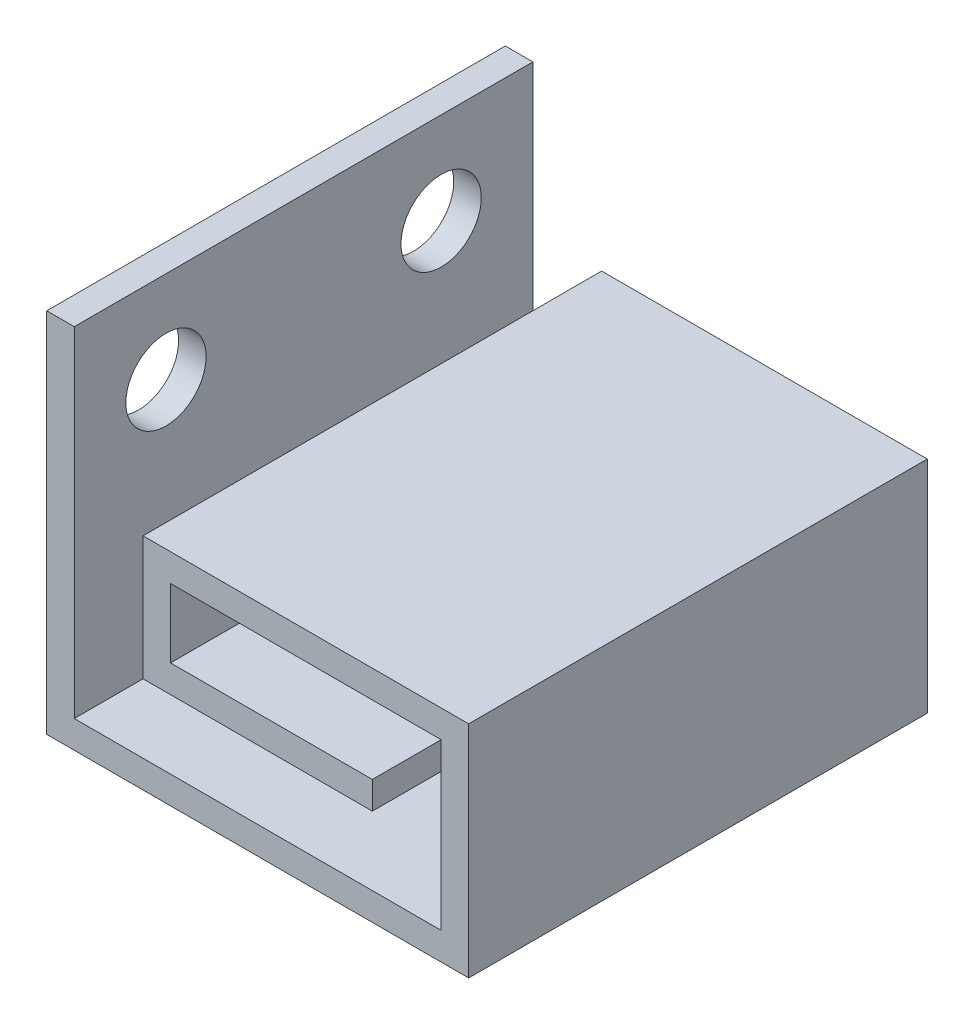
ISO-10303-21;
HEADER;
FILE_DESCRIPTION(('STEP AP214'),'2;1');
FILE_NAME('part.step','',(''),(''),'','','');
FILE_SCHEMA(('AUTOMOTIVE_DESIGN { 1 0 10303 214 1 1 1 1 }'));
ENDSEC;
DATA;
#1=APPLICATION_CONTEXT('core data for automotive mechanical design processes');
#2=APPLICATION_PROTOCOL_DEFINITION('international standard','automotive_design',2000,#1);
#3=PRODUCT_CONTEXT('',#1,'mechanical');
#4=PRODUCT('Part','Part','',(#3));
#5=PRODUCT_RELATED_PRODUCT_CATEGORY('part','',(#4));
#6=PRODUCT_DEFINITION_FORMATION('','',#4);
#7=PRODUCT_DEFINITION_CONTEXT('part definition',#1,'design');
#8=PRODUCT_DEFINITION('design','',#6,#7);
#9=PRODUCT_DEFINITION_SHAPE('','',#8);
#10=(LENGTH_UNIT() NAMED_UNIT(*) SI_UNIT(.MILLI.,.METRE.));
#11=(NAMED_UNIT(*) PLANE_ANGLE_UNIT() SI_UNIT($,.RADIAN.));
#12=(NAMED_UNIT(*) SI_UNIT($,.STERADIAN.) SOLID_ANGLE_UNIT());
#13=UNCERTAINTY_MEASURE_WITH_UNIT(LENGTH_MEASURE(1.E-05),#10,'distance_accuracy_value','');
#14=(GEOMETRIC_REPRESENTATION_CONTEXT(3) GLOBAL_UNCERTAINTY_ASSIGNED_CONTEXT((#13)) GLOBAL_UNIT_ASSIGNED_CONTEXT((#10,
#11,#12)) REPRESENTATION_CONTEXT('',''));
#15=CARTESIAN_POINT('',(0.,0.,0.));
#16=DIRECTION('',(0.,0.,1.));
#17=DIRECTION('',(1.,0.,0.));
#18=AXIS2_PLACEMENT_3D('',#15,#16,#17);
#19=CARTESIAN_POINT('',(0.,0.,10.));
#20=DIRECTION('',(1.,0.,0.));
#21=DIRECTION('',(0.,0.,-1.));
#22=AXIS2_PLACEMENT_3D('',#19,#20,#21);
#23=PLANE('',#22);
#24=CARTESIAN_POINT('',(0.,12.,6.));
#25=DIRECTION('',(1.,0.,0.));
#26=DIRECTION('',(0.,0.,-1.));
#27=AXIS2_PLACEMENT_3D('',#24,#25,#26);
#28=CIRCLE('',#27,1.75);
#29=CARTESIAN_POINT('',(0.,12.,4.25));
#30=VERTEX_POINT('',#29);
#31=EDGE_CURVE('E177',#30,#30,#28,.T.);
#32=ORIENTED_EDGE('',*,*,#31,.T.);
#33=EDGE_LOOP('',(#32));
#34=FACE_BOUND('',#33,.T.);
#35=CARTESIAN_POINT('',(0.,12.,-6.));
#36=DIRECTION('',(1.,0.,0.));
#37=DIRECTION('',(0.,0.,-1.));
#38=AXIS2_PLACEMENT_3D('',#35,#36,#37);
#39=CIRCLE('',#38,1.75);
#40=CARTESIAN_POINT('',(0.,12.,-7.75));
#41=VERTEX_POINT('',#40);
#42=EDGE_CURVE('E231',#41,#41,#39,.T.);
#43=ORIENTED_EDGE('',*,*,#42,.T.);
#44=EDGE_LOOP('',(#43));
#45=FACE_BOUND('',#44,.T.);
#46=DIRECTION('',(0.,-1.,0.));
#47=VECTOR('',#46,1.);
#48=CARTESIAN_POINT('',(0.,0.,-10.));
#49=LINE('',#48,#47);
#50=CARTESIAN_POINT('',(0.,16.,-10.));
#51=VERTEX_POINT('',#50);
#52=CARTESIAN_POINT('',(0.,0.,-10.));
#53=VERTEX_POINT('',#52);
#54=EDGE_CURVE('E173',#51,#53,#49,.T.);
#55=ORIENTED_EDGE('',*,*,#54,.T.);
#56=DIRECTION('',(0.,0.,-1.));
#57=VECTOR('',#56,1.);
#58=CARTESIAN_POINT('',(0.,0.,10.));
#59=LINE('',#58,#57);
#60=CARTESIAN_POINT('',(0.,0.,10.));
#61=VERTEX_POINT('',#60);
#62=EDGE_CURVE('E11',#61,#53,#59,.T.);
#63=ORIENTED_EDGE('',*,*,#62,.F.);
#64=DIRECTION('',(0.,-1.,0.));
#65=VECTOR('',#64,1.);
#66=CARTESIAN_POINT('',(0.,0.,10.));
#67=LINE('',#66,#65);
#68=CARTESIAN_POINT('',(0.,16.,10.));
#69=VERTEX_POINT('',#68);
#70=EDGE_CURVE('E200',#69,#61,#67,.T.);
#71=ORIENTED_EDGE('',*,*,#70,.F.);
#72=DIRECTION('',(0.,0.,-1.));
#73=VECTOR('',#72,1.);
#74=CARTESIAN_POINT('',(0.,16.,10.));
#75=LINE('',#74,#73);
#76=EDGE_CURVE('E169',#69,#51,#75,.T.);
#77=ORIENTED_EDGE('',*,*,#76,.T.);
#78=EDGE_LOOP('',(#55,#63,#71,#77));
#79=FACE_BOUND('',#78,.T.);
#80=ADVANCED_FACE('F39',(#34,#45,#79),#23,.F.);
#81=CARTESIAN_POINT('',(0.,0.,10.));
#82=DIRECTION('',(0.,1.,0.));
#83=DIRECTION('',(0.,0.,1.));
#84=AXIS2_PLACEMENT_3D('',#81,#82,#83);
#85=PLANE('',#84);
#86=DIRECTION('',(1.,0.,0.));
#87=VECTOR('',#86,1.);
#88=CARTESIAN_POINT('',(0.,0.,-10.));
#89=LINE('',#88,#87);
#90=CARTESIAN_POINT('',(18.4,0.,-10.));
#91=VERTEX_POINT('',#90);
#92=EDGE_CURVE('E176',#53,#91,#89,.T.);
#93=ORIENTED_EDGE('',*,*,#92,.T.);
#94=DIRECTION('',(0.,0.,-1.));
#95=VECTOR('',#94,1.);
#96=CARTESIAN_POINT('',(18.4,0.,10.));
#97=LINE('',#96,#95);
#98=CARTESIAN_POINT('',(18.4,0.,10.));
#99=VERTEX_POINT('',#98);
#100=EDGE_CURVE('E48',#99,#91,#97,.T.);
#101=ORIENTED_EDGE('',*,*,#100,.F.);
#102=DIRECTION('',(1.,0.,0.));
#103=VECTOR('',#102,1.);
#104=CARTESIAN_POINT('',(0.,0.,10.));
#105=LINE('',#104,#103);
#106=EDGE_CURVE('E118',#61,#99,#105,.T.);
#107=ORIENTED_EDGE('',*,*,#106,.F.);
#108=ORIENTED_EDGE('',*,*,#62,.T.);
#109=EDGE_LOOP('',(#93,#101,#107,#108));
#110=FACE_BOUND('',#109,.T.);
#111=ADVANCED_FACE('F289',(#110),#85,.F.);
#112=CARTESIAN_POINT('',(18.4,0.,10.));
#113=DIRECTION('',(-1.,0.,0.));
#114=DIRECTION('',(0.,0.,1.));
#115=AXIS2_PLACEMENT_3D('',#112,#113,#114);
#116=PLANE('',#115);
#117=DIRECTION('',(0.,1.,0.));
#118=VECTOR('',#117,1.);
#119=CARTESIAN_POINT('',(18.4,0.,-10.));
#120=LINE('',#119,#118);
#121=CARTESIAN_POINT('',(18.4,9.6,-10.));
#122=VERTEX_POINT('',#121);
#123=EDGE_CURVE('E179',#91,#122,#120,.T.);
#124=ORIENTED_EDGE('',*,*,#123,.T.);
#125=DIRECTION('',(0.,0.,-1.));
#126=VECTOR('',#125,1.);
#127=CARTESIAN_POINT('',(18.4,9.6,10.));
#128=LINE('',#127,#126);
#129=CARTESIAN_POINT('',(18.4,9.6,10.));
#130=VERTEX_POINT('',#129);
#131=EDGE_CURVE('E225',#130,#122,#128,.T.);
#132=ORIENTED_EDGE('',*,*,#131,.F.);
#133=DIRECTION('',(0.,1.,0.));
#134=VECTOR('',#133,1.);
#135=CARTESIAN_POINT('',(18.4,0.,10.));
#136=LINE('',#135,#134);
#137=EDGE_CURVE('E244',#99,#130,#136,.T.);
#138=ORIENTED_EDGE('',*,*,#137,.F.);
#139=ORIENTED_EDGE('',*,*,#100,.T.);
#140=EDGE_LOOP('',(#124,#132,#138,#139));
#141=FACE_BOUND('',#140,.T.);
#142=ADVANCED_FACE('F295',(#141),#116,.F.);
#143=CARTESIAN_POINT('',(18.4,9.6,10.));
#144=DIRECTION('',(0.,-1.,0.));
#145=DIRECTION('',(1.,0.,0.));
#146=AXIS2_PLACEMENT_3D('',#143,#144,#145);
#147=PLANE('',#146);
#148=DIRECTION('',(-1.,0.,0.));
#149=VECTOR('',#148,1.);
#150=CARTESIAN_POINT('',(18.4,9.6,-10.));
#151=LINE('',#150,#149);
#152=CARTESIAN_POINT('',(4.2,9.6,-10.));
#153=VERTEX_POINT('',#152);
#154=EDGE_CURVE('E181',#122,#153,#151,.T.);
#155=ORIENTED_EDGE('',*,*,#154,.T.);
#156=DIRECTION('',(0.,0.,-1.));
#157=VECTOR('',#156,1.);
#158=CARTESIAN_POINT('',(4.2,9.6,10.));
#159=LINE('',#158,#157);
#160=CARTESIAN_POINT('',(4.2,9.6,10.));
#161=VERTEX_POINT('',#160);
#162=EDGE_CURVE('E222',#161,#153,#159,.T.);
#163=ORIENTED_EDGE('',*,*,#162,.F.);
#164=DIRECTION('',(-1.,0.,0.));
#165=VECTOR('',#164,1.);
#166=CARTESIAN_POINT('',(18.4,9.6,10.));
#167=LINE('',#166,#165);
#168=EDGE_CURVE('E246',#130,#161,#167,.T.);
#169=ORIENTED_EDGE('',*,*,#168,.F.);
#170=ORIENTED_EDGE('',*,*,#131,.T.);
#171=EDGE_LOOP('',(#155,#163,#169,#170));
#172=FACE_BOUND('',#171,.T.);
#173=ADVANCED_FACE('F401',(#172),#147,.F.);
#174=CARTESIAN_POINT('',(4.2,9.6,10.));
#175=DIRECTION('',(1.,0.,0.));
#176=DIRECTION('',(0.,1.,0.));
#177=AXIS2_PLACEMENT_3D('',#174,#175,#176);
#178=PLANE('',#177);
#179=DIRECTION('',(0.,-1.,0.));
#180=VECTOR('',#179,1.);
#181=CARTESIAN_POINT('',(4.2,9.6,-10.));
#182=LINE('',#181,#180);
#183=CARTESIAN_POINT('',(4.2,4.2,-10.));
#184=VERTEX_POINT('',#183);
#185=EDGE_CURVE('E183',#153,#184,#182,.T.);
#186=ORIENTED_EDGE('',*,*,#185,.T.);
#187=DIRECTION('',(0.,0.,-1.));
#188=VECTOR('',#187,1.);
#189=CARTESIAN_POINT('',(4.2,4.2,10.));
#190=LINE('',#189,#188);
#191=CARTESIAN_POINT('',(4.2,4.2,10.));
#192=VERTEX_POINT('',#191);
#193=EDGE_CURVE('E219',#192,#184,#190,.T.);
#194=ORIENTED_EDGE('',*,*,#193,.F.);
#195=DIRECTION('',(0.,-1.,0.));
#196=VECTOR('',#195,1.);
#197=CARTESIAN_POINT('',(4.2,9.6,10.));
#198=LINE('',#197,#196);
#199=EDGE_CURVE('E248',#161,#192,#198,.T.);
#200=ORIENTED_EDGE('',*,*,#199,.F.);
#201=ORIENTED_EDGE('',*,*,#162,.T.);
#202=EDGE_LOOP('',(#186,#194,#200,#201));
#203=FACE_BOUND('',#202,.T.);
#204=ADVANCED_FACE('F391',(#203),#178,.F.);
#205=CARTESIAN_POINT('',(4.2,4.2,10.));
#206=DIRECTION('',(0.,1.,0.));
#207=DIRECTION('',(0.,0.,1.));
#208=AXIS2_PLACEMENT_3D('',#205,#206,#207);
#209=PLANE('',#208);
#210=DIRECTION('',(1.,0.,0.));
#211=VECTOR('',#210,1.);
#212=CARTESIAN_POINT('',(4.2,4.2,-10.));
#213=LINE('',#212,#211);
#214=CARTESIAN_POINT('',(14.2,4.2,-10.));
#215=VERTEX_POINT('',#214);
#216=EDGE_CURVE('E185',#184,#215,#213,.T.);
#217=ORIENTED_EDGE('',*,*,#216,.T.);
#218=DIRECTION('',(0.,0.,-1.));
#219=VECTOR('',#218,1.);
#220=CARTESIAN_POINT('',(14.2,4.2,10.));
#221=LINE('',#220,#219);
#222=CARTESIAN_POINT('',(14.2,4.2,10.));
#223=VERTEX_POINT('',#222);
#224=EDGE_CURVE('E216',#223,#215,#221,.T.);
#225=ORIENTED_EDGE('',*,*,#224,.F.);
#226=DIRECTION('',(1.,0.,0.));
#227=VECTOR('',#226,1.);
#228=CARTESIAN_POINT('',(4.2,4.2,10.));
#229=LINE('',#228,#227);
#230=EDGE_CURVE('E250',#192,#223,#229,.T.);
#231=ORIENTED_EDGE('',*,*,#230,.F.);
#232=ORIENTED_EDGE('',*,*,#193,.T.);
#233=EDGE_LOOP('',(#217,#225,#231,#232));
#234=FACE_BOUND('',#233,.T.);
#235=ADVANCED_FACE('F381',(#234),#209,.F.);
#236=CARTESIAN_POINT('',(14.2,5.4,10.));
#237=DIRECTION('',(-1.,0.,0.));
#238=DIRECTION('',(0.,0.,1.));
#239=AXIS2_PLACEMENT_3D('',#236,#237,#238);
#240=PLANE('',#239);
#241=DIRECTION('',(0.,1.,0.));
#242=VECTOR('',#241,1.);
#243=CARTESIAN_POINT('',(14.2,5.4,-10.));
#244=LINE('',#243,#242);
#245=CARTESIAN_POINT('',(14.2,5.4,-10.));
#246=VERTEX_POINT('',#245);
#247=EDGE_CURVE('E187',#215,#246,#244,.T.);
#248=ORIENTED_EDGE('',*,*,#247,.T.);
#249=DIRECTION('',(0.,0.,-1.));
#250=VECTOR('',#249,1.);
#251=CARTESIAN_POINT('',(14.2,5.4,10.));
#252=LINE('',#251,#250);
#253=CARTESIAN_POINT('',(14.2,5.4,10.));
#254=VERTEX_POINT('',#253);
#255=EDGE_CURVE('E213',#254,#246,#252,.T.);
#256=ORIENTED_EDGE('',*,*,#255,.F.);
#257=DIRECTION('',(0.,1.,0.));
#258=VECTOR('',#257,1.);
#259=CARTESIAN_POINT('',(14.2,5.4,10.));
#260=LINE('',#259,#258);
#261=EDGE_CURVE('E252',#223,#254,#260,.T.);
#262=ORIENTED_EDGE('',*,*,#261,.F.);
#263=ORIENTED_EDGE('',*,*,#224,.T.);
#264=EDGE_LOOP('',(#248,#256,#262,#263));
#265=FACE_BOUND('',#264,.T.);
#266=ADVANCED_FACE('F371',(#265),#240,.F.);
#267=CARTESIAN_POINT('',(5.4,5.4,10.));
#268=DIRECTION('',(0.,-1.,0.));
#269=DIRECTION('',(1.,0.,0.));
#270=AXIS2_PLACEMENT_3D('',#267,#268,#269);
#271=PLANE('',#270);
#272=DIRECTION('',(-1.,0.,0.));
#273=VECTOR('',#272,1.);
#274=CARTESIAN_POINT('',(5.4,5.4,-10.));
#275=LINE('',#274,#273);
#276=CARTESIAN_POINT('',(5.4,5.4,-10.));
#277=VERTEX_POINT('',#276);
#278=EDGE_CURVE('E189',#246,#277,#275,.T.);
#279=ORIENTED_EDGE('',*,*,#278,.T.);
#280=DIRECTION('',(0.,0.,-1.));
#281=VECTOR('',#280,1.);
#282=CARTESIAN_POINT('',(5.4,5.4,10.));
#283=LINE('',#282,#281);
#284=CARTESIAN_POINT('',(5.4,5.4,10.));
#285=VERTEX_POINT('',#284);
#286=EDGE_CURVE('E210',#285,#277,#283,.T.);
#287=ORIENTED_EDGE('',*,*,#286,.F.);
#288=DIRECTION('',(-1.,0.,0.));
#289=VECTOR('',#288,1.);
#290=CARTESIAN_POINT('',(5.4,5.4,10.));
#291=LINE('',#290,#289);
#292=EDGE_CURVE('E254',#254,#285,#291,.T.);
#293=ORIENTED_EDGE('',*,*,#292,.F.);
#294=ORIENTED_EDGE('',*,*,#255,.T.);
#295=EDGE_LOOP('',(#279,#287,#293,#294));
#296=FACE_BOUND('',#295,.T.);
#297=ADVANCED_FACE('F361',(#296),#271,.F.);
#298=CARTESIAN_POINT('',(5.4,8.4,10.));
#299=DIRECTION('',(-1.,0.,0.));
#300=DIRECTION('',(0.,0.,1.));
#301=AXIS2_PLACEMENT_3D('',#298,#299,#300);
#302=PLANE('',#301);
#303=DIRECTION('',(0.,1.,0.));
#304=VECTOR('',#303,1.);
#305=CARTESIAN_POINT('',(5.4,8.4,-10.));
#306=LINE('',#305,#304);
#307=CARTESIAN_POINT('',(5.4,8.4,-10.));
#308=VERTEX_POINT('',#307);
#309=EDGE_CURVE('E191',#277,#308,#306,.T.);
#310=ORIENTED_EDGE('',*,*,#309,.T.);
#311=DIRECTION('',(0.,0.,-1.));
#312=VECTOR('',#311,1.);
#313=CARTESIAN_POINT('',(5.4,8.4,10.));
#314=LINE('',#313,#312);
#315=CARTESIAN_POINT('',(5.4,8.4,10.));
#316=VERTEX_POINT('',#315);
#317=EDGE_CURVE('E207',#316,#308,#314,.T.);
#318=ORIENTED_EDGE('',*,*,#317,.F.);
#319=DIRECTION('',(0.,1.,0.));
#320=VECTOR('',#319,1.);
#321=CARTESIAN_POINT('',(5.4,8.4,10.));
#322=LINE('',#321,#320);
#323=EDGE_CURVE('E256',#285,#316,#322,.T.);
#324=ORIENTED_EDGE('',*,*,#323,.F.);
#325=ORIENTED_EDGE('',*,*,#286,.T.);
#326=EDGE_LOOP('',(#310,#318,#324,#325));
#327=FACE_BOUND('',#326,.T.);
#328=ADVANCED_FACE('F352',(#327),#302,.F.);
#329=CARTESIAN_POINT('',(17.2,8.4,10.));
#330=DIRECTION('',(0.,1.,0.));
#331=DIRECTION('',(0.,0.,1.));
#332=AXIS2_PLACEMENT_3D('',#329,#330,#331);
#333=PLANE('',#332);
#334=DIRECTION('',(1.,0.,0.));
#335=VECTOR('',#334,1.);
#336=CARTESIAN_POINT('',(17.2,8.4,-10.));
#337=LINE('',#336,#335);
#338=CARTESIAN_POINT('',(17.2,8.4,-10.));
#339=VERTEX_POINT('',#338);
#340=EDGE_CURVE('E193',#308,#339,#337,.T.);
#341=ORIENTED_EDGE('',*,*,#340,.T.);
#342=DIRECTION('',(0.,0.,-1.));
#343=VECTOR('',#342,1.);
#344=CARTESIAN_POINT('',(17.2,8.4,10.));
#345=LINE('',#344,#343);
#346=CARTESIAN_POINT('',(17.2,8.4,10.));
#347=VERTEX_POINT('',#346);
#348=EDGE_CURVE('E204',#347,#339,#345,.T.);
#349=ORIENTED_EDGE('',*,*,#348,.F.);
#350=DIRECTION('',(1.,0.,0.));
#351=VECTOR('',#350,1.);
#352=CARTESIAN_POINT('',(17.2,8.4,10.));
#353=LINE('',#352,#351);
#354=EDGE_CURVE('E258',#316,#347,#353,.T.);
#355=ORIENTED_EDGE('',*,*,#354,.F.);
#356=ORIENTED_EDGE('',*,*,#317,.T.);
#357=EDGE_LOOP('',(#341,#349,#355,#356));
#358=FACE_BOUND('',#357,.T.);
#359=ADVANCED_FACE('F264',(#358),#333,.F.);
#360=CARTESIAN_POINT('',(17.2,1.2,10.));
#361=DIRECTION('',(1.,0.,0.));
#362=DIRECTION('',(0.,0.,-1.));
#363=AXIS2_PLACEMENT_3D('',#360,#361,#362);
#364=PLANE('',#363);
#365=DIRECTION('',(0.,-1.,0.));
#366=VECTOR('',#365,1.);
#367=CARTESIAN_POINT('',(17.2,1.2,-10.));
#368=LINE('',#367,#366);
#369=CARTESIAN_POINT('',(17.2,1.2,-10.));
#370=VERTEX_POINT('',#369);
#371=EDGE_CURVE('E195',#339,#370,#368,.T.);
#372=ORIENTED_EDGE('',*,*,#371,.T.);
#373=DIRECTION('',(0.,0.,-1.));
#374=VECTOR('',#373,1.);
#375=CARTESIAN_POINT('',(17.2,1.2,10.));
#376=LINE('',#375,#374);
#377=CARTESIAN_POINT('',(17.2,1.2,10.));
#378=VERTEX_POINT('',#377);
#379=EDGE_CURVE('E164',#378,#370,#376,.T.);
#380=ORIENTED_EDGE('',*,*,#379,.F.);
#381=DIRECTION('',(0.,-1.,0.));
#382=VECTOR('',#381,1.);
#383=CARTESIAN_POINT('',(17.2,1.2,10.));
#384=LINE('',#383,#382);
#385=EDGE_CURVE('E155',#347,#378,#384,.T.);
#386=ORIENTED_EDGE('',*,*,#385,.F.);
#387=ORIENTED_EDGE('',*,*,#348,.T.);
#388=EDGE_LOOP('',(#372,#380,#386,#387));
#389=FACE_BOUND('',#388,.T.);
#390=ADVANCED_FACE('F268',(#389),#364,.F.);
#391=CARTESIAN_POINT('',(1.2,1.2,10.));
#392=DIRECTION('',(0.,-1.,0.));
#393=DIRECTION('',(0.,0.,-1.));
#394=AXIS2_PLACEMENT_3D('',#391,#392,#393);
#395=PLANE('',#394);
#396=DIRECTION('',(-1.,0.,0.));
#397=VECTOR('',#396,1.);
#398=CARTESIAN_POINT('',(1.2,1.2,-10.));
#399=LINE('',#398,#397);
#400=CARTESIAN_POINT('',(1.2,1.2,-10.));
#401=VERTEX_POINT('',#400);
#402=EDGE_CURVE('E163',#370,#401,#399,.T.);
#403=ORIENTED_EDGE('',*,*,#402,.T.);
#404=DIRECTION('',(0.,0.,-1.));
#405=VECTOR('',#404,1.);
#406=CARTESIAN_POINT('',(1.2,1.2,10.));
#407=LINE('',#406,#405);
#408=CARTESIAN_POINT('',(1.2,1.2,10.));
#409=VERTEX_POINT('',#408);
#410=EDGE_CURVE('E160',#409,#401,#407,.T.);
#411=ORIENTED_EDGE('',*,*,#410,.F.);
#412=DIRECTION('',(-1.,0.,0.));
#413=VECTOR('',#412,1.);
#414=CARTESIAN_POINT('',(1.2,1.2,10.));
#415=LINE('',#414,#413);
#416=EDGE_CURVE('E149',#378,#409,#415,.T.);
#417=ORIENTED_EDGE('',*,*,#416,.F.);
#418=ORIENTED_EDGE('',*,*,#379,.T.);
#419=EDGE_LOOP('',(#403,#411,#417,#418));
#420=FACE_BOUND('',#419,.T.);
#421=ADVANCED_FACE('F161',(#420),#395,.F.);
#422=CARTESIAN_POINT('',(1.2,16.,10.));
#423=DIRECTION('',(-1.,0.,0.));
#424=DIRECTION('',(0.,-1.,0.));
#425=AXIS2_PLACEMENT_3D('',#422,#423,#424);
#426=PLANE('',#425);
#427=CARTESIAN_POINT('',(1.2,12.,6.));
#428=DIRECTION('',(-1.,0.,0.));
#429=DIRECTION('',(0.,-1.,0.));
#430=AXIS2_PLACEMENT_3D('',#427,#428,#429);
#431=CIRCLE('',#430,1.75);
#432=CARTESIAN_POINT('',(1.2,10.25,6.));
#433=VERTEX_POINT('',#432);
#434=EDGE_CURVE('E42',#433,#433,#431,.T.);
#435=ORIENTED_EDGE('',*,*,#434,.T.);
#436=EDGE_LOOP('',(#435));
#437=FACE_BOUND('',#436,.T.);
#438=CARTESIAN_POINT('',(1.2,12.,-6.));
#439=DIRECTION('',(-1.,0.,0.));
#440=DIRECTION('',(0.,-1.,0.));
#441=AXIS2_PLACEMENT_3D('',#438,#439,#440);
#442=CIRCLE('',#441,1.75);
#443=CARTESIAN_POINT('',(1.2,10.25,-6.));
#444=VERTEX_POINT('',#443);
#445=EDGE_CURVE('E229',#444,#444,#442,.T.);
#446=ORIENTED_EDGE('',*,*,#445,.T.);
#447=EDGE_LOOP('',(#446));
#448=FACE_BOUND('',#447,.T.);
#449=DIRECTION('',(0.,1.,0.));
#450=VECTOR('',#449,1.);
#451=CARTESIAN_POINT('',(1.2,16.,-10.));
#452=LINE('',#451,#450);
#453=CARTESIAN_POINT('',(1.2,16.,-10.));
#454=VERTEX_POINT('',#453);
#455=EDGE_CURVE('E104',#401,#454,#452,.T.);
#456=ORIENTED_EDGE('',*,*,#455,.T.);
#457=DIRECTION('',(0.,0.,-1.));
#458=VECTOR('',#457,1.);
#459=CARTESIAN_POINT('',(1.2,16.,10.));
#460=LINE('',#459,#458);
#461=CARTESIAN_POINT('',(1.2,16.,10.));
#462=VERTEX_POINT('',#461);
#463=EDGE_CURVE('E165',#462,#454,#460,.T.);
#464=ORIENTED_EDGE('',*,*,#463,.F.);
#465=DIRECTION('',(0.,1.,0.));
#466=VECTOR('',#465,1.);
#467=CARTESIAN_POINT('',(1.2,16.,10.));
#468=LINE('',#467,#466);
#469=EDGE_CURVE('E153',#409,#462,#468,.T.);
#470=ORIENTED_EDGE('',*,*,#469,.F.);
#471=ORIENTED_EDGE('',*,*,#410,.T.);
#472=EDGE_LOOP('',(#456,#464,#470,#471));
#473=FACE_BOUND('',#472,.T.);
#474=ADVANCED_FACE('F167',(#437,#448,#473),#426,.F.);
#475=CARTESIAN_POINT('',(0.,16.,10.));
#476=DIRECTION('',(0.,-1.,0.));
#477=DIRECTION('',(0.,0.,-1.));
#478=AXIS2_PLACEMENT_3D('',#475,#476,#477);
#479=PLANE('',#478);
#480=DIRECTION('',(-1.,0.,0.));
#481=VECTOR('',#480,1.);
#482=CARTESIAN_POINT('',(0.,16.,-10.));
#483=LINE('',#482,#481);
#484=EDGE_CURVE('E110',#454,#51,#483,.T.);
#485=ORIENTED_EDGE('',*,*,#484,.T.);
#486=ORIENTED_EDGE('',*,*,#76,.F.);
#487=DIRECTION('',(-1.,0.,0.));
#488=VECTOR('',#487,1.);
#489=CARTESIAN_POINT('',(0.,16.,10.));
#490=LINE('',#489,#488);
#491=EDGE_CURVE('E57',#462,#69,#490,.T.);
#492=ORIENTED_EDGE('',*,*,#491,.F.);
#493=ORIENTED_EDGE('',*,*,#463,.T.);
#494=EDGE_LOOP('',(#485,#486,#492,#493));
#495=FACE_BOUND('',#494,.T.);
#496=ADVANCED_FACE('F276',(#495),#479,.F.);
#497=CARTESIAN_POINT('',(0.,0.,10.));
#498=DIRECTION('',(0.,0.,-1.));
#499=DIRECTION('',(-1.,0.,0.));
#500=AXIS2_PLACEMENT_3D('',#497,#498,#499);
#501=PLANE('',#500);
#502=ORIENTED_EDGE('',*,*,#70,.T.);
#503=ORIENTED_EDGE('',*,*,#106,.T.);
#504=ORIENTED_EDGE('',*,*,#137,.T.);
#505=ORIENTED_EDGE('',*,*,#168,.T.);
#506=ORIENTED_EDGE('',*,*,#199,.T.);
#507=ORIENTED_EDGE('',*,*,#230,.T.);
#508=ORIENTED_EDGE('',*,*,#261,.T.);
#509=ORIENTED_EDGE('',*,*,#292,.T.);
#510=ORIENTED_EDGE('',*,*,#323,.T.);
#511=ORIENTED_EDGE('',*,*,#354,.T.);
#512=ORIENTED_EDGE('',*,*,#385,.T.);
#513=ORIENTED_EDGE('',*,*,#416,.T.);
#514=ORIENTED_EDGE('',*,*,#469,.T.);
#515=ORIENTED_EDGE('',*,*,#491,.T.);
#516=EDGE_LOOP('',(#502,#503,#504,#505,#506,#507,#508,#509,#510,#511,#512,#513,#514,#515));
#517=FACE_BOUND('',#516,.T.);
#518=ADVANCED_FACE('F151',(#517),#501,.F.);
#519=CARTESIAN_POINT('',(0.,0.,-10.));
#520=DIRECTION('',(0.,0.,-1.));
#521=DIRECTION('',(-1.,0.,0.));
#522=AXIS2_PLACEMENT_3D('',#519,#520,#521);
#523=PLANE('',#522);
#524=ORIENTED_EDGE('',*,*,#54,.F.);
#525=ORIENTED_EDGE('',*,*,#484,.F.);
#526=ORIENTED_EDGE('',*,*,#455,.F.);
#527=ORIENTED_EDGE('',*,*,#402,.F.);
#528=ORIENTED_EDGE('',*,*,#371,.F.);
#529=ORIENTED_EDGE('',*,*,#340,.F.);
#530=ORIENTED_EDGE('',*,*,#309,.F.);
#531=ORIENTED_EDGE('',*,*,#278,.F.);
#532=ORIENTED_EDGE('',*,*,#247,.F.);
#533=ORIENTED_EDGE('',*,*,#216,.F.);
#534=ORIENTED_EDGE('',*,*,#185,.F.);
#535=ORIENTED_EDGE('',*,*,#154,.F.);
#536=ORIENTED_EDGE('',*,*,#123,.F.);
#537=ORIENTED_EDGE('',*,*,#92,.F.);
#538=EDGE_LOOP('',(#524,#525,#526,#527,#528,#529,#530,#531,#532,#533,#534,#535,#536,#537));
#539=FACE_BOUND('',#538,.T.);
#540=ADVANCED_FACE('F271',(#539),#523,.T.);
#541=CARTESIAN_POINT('',(-8.8,12.,-6.));
#542=DIRECTION('',(1.,0.,0.));
#543=DIRECTION('',(0.,1.,0.));
#544=AXIS2_PLACEMENT_3D('',#541,#542,#543);
#545=CYLINDRICAL_SURFACE('',#544,1.75);
#546=ORIENTED_EDGE('',*,*,#445,.F.);
#547=EDGE_LOOP('',(#546));
#548=FACE_BOUND('',#547,.T.);
#549=ORIENTED_EDGE('',*,*,#42,.F.);
#550=EDGE_LOOP('',(#549));
#551=FACE_BOUND('',#550,.T.);
#552=ADVANCED_FACE('F300',(#548,#551),#545,.F.);
#553=CARTESIAN_POINT('',(-8.8,12.,6.));
#554=DIRECTION('',(1.,0.,0.));
#555=DIRECTION('',(0.,1.,0.));
#556=AXIS2_PLACEMENT_3D('',#553,#554,#555);
#557=CYLINDRICAL_SURFACE('',#556,1.75);
#558=ORIENTED_EDGE('',*,*,#434,.F.);
#559=EDGE_LOOP('',(#558));
#560=FACE_BOUND('',#559,.T.);
#561=ORIENTED_EDGE('',*,*,#31,.F.);
#562=EDGE_LOOP('',(#561));
#563=FACE_BOUND('',#562,.T.);
#564=ADVANCED_FACE('F298',(#560,#563),#557,.F.);
#565=CLOSED_SHELL('',(#80,#111,#142,#173,#204,#235,#266,#297,#328,#359,#390,#421,#474,#496,#518,
#540,#552,#564));
#566=MANIFOLD_SOLID_BREP('B2',#565);
#567=ADVANCED_BREP_SHAPE_REPRESENTATION('',(#18,#566),#14);
#568=SHAPE_DEFINITION_REPRESENTATION(#9,#567);
ENDSEC;
END-ISO-10303-21;
